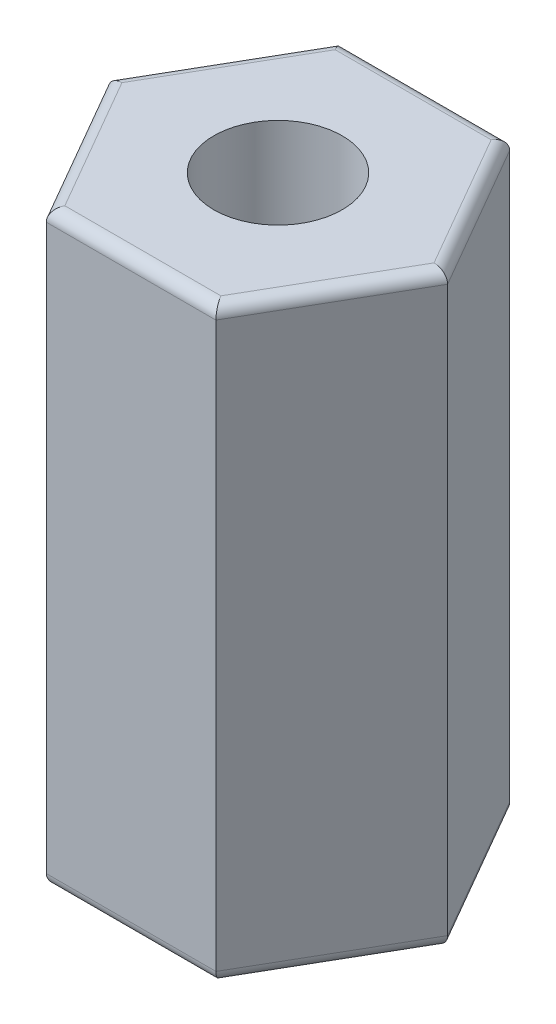
ISO-10303-21;
HEADER;
FILE_DESCRIPTION(('STEP AP214'),'2;1');
FILE_NAME('part.step','',(''),(''),'','','');
FILE_SCHEMA(('AUTOMOTIVE_DESIGN { 1 0 10303 214 1 1 1 1 }'));
ENDSEC;
DATA;
#1=APPLICATION_CONTEXT('core data for automotive mechanical design processes');
#2=APPLICATION_PROTOCOL_DEFINITION('international standard','automotive_design',2000,#1);
#3=PRODUCT_CONTEXT('',#1,'mechanical');
#4=PRODUCT('Part','Part','',(#3));
#5=PRODUCT_RELATED_PRODUCT_CATEGORY('part','',(#4));
#6=PRODUCT_DEFINITION_FORMATION('','',#4);
#7=PRODUCT_DEFINITION_CONTEXT('part definition',#1,'design');
#8=PRODUCT_DEFINITION('design','',#6,#7);
#9=PRODUCT_DEFINITION_SHAPE('','',#8);
#10=(LENGTH_UNIT() NAMED_UNIT(*) SI_UNIT(.MILLI.,.METRE.));
#11=(NAMED_UNIT(*) PLANE_ANGLE_UNIT() SI_UNIT($,.RADIAN.));
#12=(NAMED_UNIT(*) SI_UNIT($,.STERADIAN.) SOLID_ANGLE_UNIT());
#13=UNCERTAINTY_MEASURE_WITH_UNIT(LENGTH_MEASURE(1.E-05),#10,'distance_accuracy_value','');
#14=(GEOMETRIC_REPRESENTATION_CONTEXT(3) GLOBAL_UNCERTAINTY_ASSIGNED_CONTEXT((#13)) GLOBAL_UNIT_ASSIGNED_CONTEXT((#10,
#11,#12)) REPRESENTATION_CONTEXT('',''));
#15=CARTESIAN_POINT('',(0.,0.,0.));
#16=DIRECTION('',(0.,0.,1.));
#17=DIRECTION('',(1.,0.,0.));
#18=AXIS2_PLACEMENT_3D('',#15,#16,#17);
#19=CARTESIAN_POINT('',(1.44337567297406,10.,2.5));
#20=DIRECTION('',(-0.866025403784439,0.,-0.5));
#21=DIRECTION('',(-0.5,0.,0.866025403784439));
#22=AXIS2_PLACEMENT_3D('',#19,#20,#21);
#23=PLANE('',#22);
#24=DIRECTION('',(0.,-1.,0.));
#25=VECTOR('',#24,1.);
#26=CARTESIAN_POINT('',(2.88675134594813,10.,0.));
#27=LINE('',#26,#25);
#28=CARTESIAN_POINT('',(2.88675134594813,9.8,0.));
#29=VERTEX_POINT('',#28);
#30=CARTESIAN_POINT('',(2.88675134594813,0.200000000000001,0.));
#31=VERTEX_POINT('',#30);
#32=EDGE_CURVE('E149',#29,#31,#27,.T.);
#33=ORIENTED_EDGE('',*,*,#32,.F.);
#34=DIRECTION('',(0.5,0.,-0.866025403784439));
#35=VECTOR('',#34,1.);
#36=CARTESIAN_POINT('',(1.44337567297406,9.8,2.5));
#37=LINE('',#36,#35);
#38=CARTESIAN_POINT('',(1.44337567297406,9.8,2.5));
#39=VERTEX_POINT('',#38);
#40=EDGE_CURVE('E140',#29,#39,#37,.F.);
#41=ORIENTED_EDGE('',*,*,#40,.T.);
#42=DIRECTION('',(0.,-1.,0.));
#43=VECTOR('',#42,1.);
#44=CARTESIAN_POINT('',(1.44337567297406,10.,2.5));
#45=LINE('',#44,#43);
#46=CARTESIAN_POINT('',(1.44337567297406,0.200000000000001,2.5));
#47=VERTEX_POINT('',#46);
#48=EDGE_CURVE('E206',#39,#47,#45,.T.);
#49=ORIENTED_EDGE('',*,*,#48,.T.);
#50=DIRECTION('',(0.5,0.,-0.866025403784439));
#51=VECTOR('',#50,1.);
#52=CARTESIAN_POINT('',(1.44337567297406,0.200000000000001,2.5));
#53=LINE('',#52,#51);
#54=EDGE_CURVE('E181',#47,#31,#53,.T.);
#55=ORIENTED_EDGE('',*,*,#54,.T.);
#56=EDGE_LOOP('',(#33,#41,#49,#55));
#57=FACE_BOUND('',#56,.T.);
#58=ADVANCED_FACE('F33',(#57),#23,.F.);
#59=CARTESIAN_POINT('',(2.88675134594813,10.,0.));
#60=DIRECTION('',(-0.866025403784439,0.,0.5));
#61=DIRECTION('',(0.5,0.,0.866025403784439));
#62=AXIS2_PLACEMENT_3D('',#59,#60,#61);
#63=PLANE('',#62);
#64=DIRECTION('',(0.,-1.,0.));
#65=VECTOR('',#64,1.);
#66=CARTESIAN_POINT('',(1.44337567297406,10.,-2.5));
#67=LINE('',#66,#65);
#68=CARTESIAN_POINT('',(1.44337567297406,9.8,-2.5));
#69=VERTEX_POINT('',#68);
#70=CARTESIAN_POINT('',(1.44337567297406,0.200000000000001,-2.5));
#71=VERTEX_POINT('',#70);
#72=EDGE_CURVE('E152',#69,#71,#67,.T.);
#73=ORIENTED_EDGE('',*,*,#72,.F.);
#74=DIRECTION('',(-0.5,0.,-0.866025403784439));
#75=VECTOR('',#74,1.);
#76=CARTESIAN_POINT('',(2.88675134594813,9.8,0.));
#77=LINE('',#76,#75);
#78=EDGE_CURVE('E186',#69,#29,#77,.F.);
#79=ORIENTED_EDGE('',*,*,#78,.T.);
#80=ORIENTED_EDGE('',*,*,#32,.T.);
#81=DIRECTION('',(-0.5,0.,-0.866025403784439));
#82=VECTOR('',#81,1.);
#83=CARTESIAN_POINT('',(2.88675134594813,0.200000000000001,0.));
#84=LINE('',#83,#82);
#85=EDGE_CURVE('E184',#31,#71,#84,.T.);
#86=ORIENTED_EDGE('',*,*,#85,.T.);
#87=EDGE_LOOP('',(#73,#79,#80,#86));
#88=FACE_BOUND('',#87,.T.);
#89=ADVANCED_FACE('F267',(#88),#63,.F.);
#90=CARTESIAN_POINT('',(1.44337567297406,10.,-2.5));
#91=DIRECTION('',(0.,0.,1.));
#92=DIRECTION('',(1.,0.,0.));
#93=AXIS2_PLACEMENT_3D('',#90,#91,#92);
#94=PLANE('',#93);
#95=DIRECTION('',(0.,-1.,0.));
#96=VECTOR('',#95,1.);
#97=CARTESIAN_POINT('',(-1.44337567297406,10.,-2.5));
#98=LINE('',#97,#96);
#99=CARTESIAN_POINT('',(-1.44337567297406,9.8,-2.5));
#100=VERTEX_POINT('',#99);
#101=CARTESIAN_POINT('',(-1.44337567297406,0.200000000000001,-2.5));
#102=VERTEX_POINT('',#101);
#103=EDGE_CURVE('E258',#100,#102,#98,.T.);
#104=ORIENTED_EDGE('',*,*,#103,.F.);
#105=DIRECTION('',(-1.,0.,0.));
#106=VECTOR('',#105,1.);
#107=CARTESIAN_POINT('',(1.44337567297406,9.8,-2.5));
#108=LINE('',#107,#106);
#109=EDGE_CURVE('E165',#100,#69,#108,.F.);
#110=ORIENTED_EDGE('',*,*,#109,.T.);
#111=ORIENTED_EDGE('',*,*,#72,.T.);
#112=DIRECTION('',(-1.,0.,0.));
#113=VECTOR('',#112,1.);
#114=CARTESIAN_POINT('',(1.44337567297406,0.200000000000001,-2.5));
#115=LINE('',#114,#113);
#116=EDGE_CURVE('E163',#71,#102,#115,.T.);
#117=ORIENTED_EDGE('',*,*,#116,.T.);
#118=EDGE_LOOP('',(#104,#110,#111,#117));
#119=FACE_BOUND('',#118,.T.);
#120=ADVANCED_FACE('F264',(#119),#94,.F.);
#121=CARTESIAN_POINT('',(-1.44337567297406,10.,-2.5));
#122=DIRECTION('',(0.866025403784439,0.,0.5));
#123=DIRECTION('',(0.5,0.,-0.866025403784439));
#124=AXIS2_PLACEMENT_3D('',#121,#122,#123);
#125=PLANE('',#124);
#126=DIRECTION('',(0.,-1.,0.));
#127=VECTOR('',#126,1.);
#128=CARTESIAN_POINT('',(-2.88675134594813,10.,0.));
#129=LINE('',#128,#127);
#130=CARTESIAN_POINT('',(-2.88675134594813,9.8,0.));
#131=VERTEX_POINT('',#130);
#132=CARTESIAN_POINT('',(-2.88675134594813,0.200000000000001,0.));
#133=VERTEX_POINT('',#132);
#134=EDGE_CURVE('E251',#131,#133,#129,.T.);
#135=ORIENTED_EDGE('',*,*,#134,.F.);
#136=DIRECTION('',(-0.5,0.,0.866025403784439));
#137=VECTOR('',#136,1.);
#138=CARTESIAN_POINT('',(-1.44337567297406,9.8,-2.5));
#139=LINE('',#138,#137);
#140=EDGE_CURVE('E170',#131,#100,#139,.F.);
#141=ORIENTED_EDGE('',*,*,#140,.T.);
#142=ORIENTED_EDGE('',*,*,#103,.T.);
#143=DIRECTION('',(-0.5,0.,0.866025403784439));
#144=VECTOR('',#143,1.);
#145=CARTESIAN_POINT('',(-1.44337567297406,0.200000000000001,-2.5));
#146=LINE('',#145,#144);
#147=EDGE_CURVE('E168',#102,#133,#146,.T.);
#148=ORIENTED_EDGE('',*,*,#147,.T.);
#149=EDGE_LOOP('',(#135,#141,#142,#148));
#150=FACE_BOUND('',#149,.T.);
#151=ADVANCED_FACE('F274',(#150),#125,.F.);
#152=CARTESIAN_POINT('',(-2.88675134594813,10.,0.));
#153=DIRECTION('',(0.866025403784439,0.,-0.5));
#154=DIRECTION('',(-0.5,0.,-0.866025403784439));
#155=AXIS2_PLACEMENT_3D('',#152,#153,#154);
#156=PLANE('',#155);
#157=DIRECTION('',(0.,-1.,0.));
#158=VECTOR('',#157,1.);
#159=CARTESIAN_POINT('',(-1.44337567297406,10.,2.5));
#160=LINE('',#159,#158);
#161=CARTESIAN_POINT('',(-1.44337567297406,9.8,2.5));
#162=VERTEX_POINT('',#161);
#163=CARTESIAN_POINT('',(-1.44337567297406,0.200000000000001,2.5));
#164=VERTEX_POINT('',#163);
#165=EDGE_CURVE('E247',#162,#164,#160,.T.);
#166=ORIENTED_EDGE('',*,*,#165,.F.);
#167=DIRECTION('',(0.5,0.,0.866025403784439));
#168=VECTOR('',#167,1.);
#169=CARTESIAN_POINT('',(-2.88675134594813,9.8,0.));
#170=LINE('',#169,#168);
#171=EDGE_CURVE('E174',#162,#131,#170,.F.);
#172=ORIENTED_EDGE('',*,*,#171,.T.);
#173=ORIENTED_EDGE('',*,*,#134,.T.);
#174=DIRECTION('',(0.5,0.,0.866025403784439));
#175=VECTOR('',#174,1.);
#176=CARTESIAN_POINT('',(-2.88675134594813,0.200000000000001,0.));
#177=LINE('',#176,#175);
#178=EDGE_CURVE('E172',#133,#164,#177,.T.);
#179=ORIENTED_EDGE('',*,*,#178,.T.);
#180=EDGE_LOOP('',(#166,#172,#173,#179));
#181=FACE_BOUND('',#180,.T.);
#182=ADVANCED_FACE('F361',(#181),#156,.F.);
#183=CARTESIAN_POINT('',(-1.44337567297406,10.,2.5));
#184=DIRECTION('',(0.,0.,-1.));
#185=DIRECTION('',(-1.,0.,0.));
#186=AXIS2_PLACEMENT_3D('',#183,#184,#185);
#187=PLANE('',#186);
#188=ORIENTED_EDGE('',*,*,#48,.F.);
#189=DIRECTION('',(1.,0.,0.));
#190=VECTOR('',#189,1.);
#191=CARTESIAN_POINT('',(-1.44337567297406,9.8,2.5));
#192=LINE('',#191,#190);
#193=EDGE_CURVE('E179',#39,#162,#192,.F.);
#194=ORIENTED_EDGE('',*,*,#193,.T.);
#195=ORIENTED_EDGE('',*,*,#165,.T.);
#196=DIRECTION('',(1.,0.,0.));
#197=VECTOR('',#196,1.);
#198=CARTESIAN_POINT('',(-1.44337567297406,0.200000000000001,2.5));
#199=LINE('',#198,#197);
#200=EDGE_CURVE('E176',#164,#47,#199,.T.);
#201=ORIENTED_EDGE('',*,*,#200,.T.);
#202=EDGE_LOOP('',(#188,#194,#195,#201));
#203=FACE_BOUND('',#202,.T.);
#204=ADVANCED_FACE('F244',(#203),#187,.F.);
#205=CARTESIAN_POINT('',(2.88675134594813,10.,0.));
#206=DIRECTION('',(0.,1.,0.));
#207=DIRECTION('',(0.,0.,1.));
#208=AXIS2_PLACEMENT_3D('',#205,#206,#207);
#209=PLANE('',#208);
#210=CARTESIAN_POINT('',(0.,10.,0.));
#211=DIRECTION('',(0.,1.,0.));
#212=DIRECTION('',(0.,0.,1.));
#213=AXIS2_PLACEMENT_3D('',#210,#211,#212);
#214=CIRCLE('',#213,1.0922);
#215=CARTESIAN_POINT('',(0.,10.,1.0922));
#216=VERTEX_POINT('',#215);
#217=EDGE_CURVE('E209',#216,#216,#214,.T.);
#218=ORIENTED_EDGE('',*,*,#217,.F.);
#219=EDGE_LOOP('',(#218));
#220=FACE_BOUND('',#219,.T.);
#221=DIRECTION('',(-0.5,0.,-0.866025403784439));
#222=VECTOR('',#221,1.);
#223=CARTESIAN_POINT('',(1.27017059221718,10.,-2.4));
#224=LINE('',#223,#222);
#225=CARTESIAN_POINT('',(2.65581123827228,10.,0.));
#226=VERTEX_POINT('',#225);
#227=CARTESIAN_POINT('',(1.32790561913614,10.,-2.3));
#228=VERTEX_POINT('',#227);
#229=EDGE_CURVE('E128',#226,#228,#224,.T.);
#230=ORIENTED_EDGE('',*,*,#229,.T.);
#231=DIRECTION('',(-1.,0.,0.));
#232=VECTOR('',#231,1.);
#233=CARTESIAN_POINT('',(-1.44337567297406,10.,-2.3));
#234=LINE('',#233,#232);
#235=CARTESIAN_POINT('',(-1.32790561913614,10.,-2.3));
#236=VERTEX_POINT('',#235);
#237=EDGE_CURVE('E161',#228,#236,#234,.T.);
#238=ORIENTED_EDGE('',*,*,#237,.T.);
#239=DIRECTION('',(-0.5,0.,0.866025403784439));
#240=VECTOR('',#239,1.);
#241=CARTESIAN_POINT('',(-2.71354626519124,10.,0.100000000000001));
#242=LINE('',#241,#240);
#243=CARTESIAN_POINT('',(-2.65581123827228,10.,0.));
#244=VERTEX_POINT('',#243);
#245=EDGE_CURVE('E159',#236,#244,#242,.T.);
#246=ORIENTED_EDGE('',*,*,#245,.T.);
#247=DIRECTION('',(0.5,0.,0.866025403784439));
#248=VECTOR('',#247,1.);
#249=CARTESIAN_POINT('',(-1.27017059221718,10.,2.4));
#250=LINE('',#249,#248);
#251=CARTESIAN_POINT('',(-1.32790561913614,10.,2.3));
#252=VERTEX_POINT('',#251);
#253=EDGE_CURVE('E157',#244,#252,#250,.T.);
#254=ORIENTED_EDGE('',*,*,#253,.T.);
#255=DIRECTION('',(1.,0.,0.));
#256=VECTOR('',#255,1.);
#257=CARTESIAN_POINT('',(1.44337567297406,10.,2.3));
#258=LINE('',#257,#256);
#259=CARTESIAN_POINT('',(1.32790561913614,10.,2.3));
#260=VERTEX_POINT('',#259);
#261=EDGE_CURVE('E131',#252,#260,#258,.T.);
#262=ORIENTED_EDGE('',*,*,#261,.T.);
#263=DIRECTION('',(0.5,0.,-0.866025403784439));
#264=VECTOR('',#263,1.);
#265=CARTESIAN_POINT('',(2.71354626519124,10.,-0.100000000000001));
#266=LINE('',#265,#264);
#267=EDGE_CURVE('E123',#260,#226,#266,.T.);
#268=ORIENTED_EDGE('',*,*,#267,.T.);
#269=EDGE_LOOP('',(#230,#238,#246,#254,#262,#268));
#270=FACE_BOUND('',#269,.T.);
#271=ADVANCED_FACE('F125',(#220,#270),#209,.T.);
#272=CARTESIAN_POINT('',(2.88675134594813,0.,0.));
#273=DIRECTION('',(0.,1.,0.));
#274=DIRECTION('',(0.,0.,1.));
#275=AXIS2_PLACEMENT_3D('',#272,#273,#274);
#276=PLANE('',#275);
#277=CARTESIAN_POINT('',(0.,0.,0.));
#278=DIRECTION('',(0.,-1.,0.));
#279=DIRECTION('',(0.,0.,-1.));
#280=AXIS2_PLACEMENT_3D('',#277,#278,#279);
#281=CIRCLE('',#280,1.0922);
#282=CARTESIAN_POINT('',(0.,0.,-1.0922));
#283=VERTEX_POINT('',#282);
#284=EDGE_CURVE('E460',#283,#283,#281,.T.);
#285=ORIENTED_EDGE('',*,*,#284,.F.);
#286=EDGE_LOOP('',(#285));
#287=FACE_BOUND('',#286,.T.);
#288=DIRECTION('',(0.5,0.,-0.866025403784439));
#289=VECTOR('',#288,1.);
#290=CARTESIAN_POINT('',(2.71354626519124,0.,-0.100000000000001));
#291=LINE('',#290,#289);
#292=CARTESIAN_POINT('',(2.65581123827228,0.,0.));
#293=VERTEX_POINT('',#292);
#294=CARTESIAN_POINT('',(1.32790561913614,0.,2.3));
#295=VERTEX_POINT('',#294);
#296=EDGE_CURVE('E188',#293,#295,#291,.F.);
#297=ORIENTED_EDGE('',*,*,#296,.T.);
#298=DIRECTION('',(1.,0.,0.));
#299=VECTOR('',#298,1.);
#300=CARTESIAN_POINT('',(2.88675134594813,0.,2.3));
#301=LINE('',#300,#299);
#302=CARTESIAN_POINT('',(-1.32790561913614,0.,2.3));
#303=VERTEX_POINT('',#302);
#304=EDGE_CURVE('E11',#295,#303,#301,.F.);
#305=ORIENTED_EDGE('',*,*,#304,.T.);
#306=DIRECTION('',(0.5,0.,0.866025403784439));
#307=VECTOR('',#306,1.);
#308=CARTESIAN_POINT('',(-1.27017059221718,0.,2.4));
#309=LINE('',#308,#307);
#310=CARTESIAN_POINT('',(-2.65581123827228,0.,0.));
#311=VERTEX_POINT('',#310);
#312=EDGE_CURVE('E42',#303,#311,#309,.F.);
#313=ORIENTED_EDGE('',*,*,#312,.T.);
#314=DIRECTION('',(-0.5,0.,0.866025403784439));
#315=VECTOR('',#314,1.);
#316=CARTESIAN_POINT('',(-1.27017059221718,0.,-2.4));
#317=LINE('',#316,#315);
#318=CARTESIAN_POINT('',(-1.32790561913614,0.,-2.3));
#319=VERTEX_POINT('',#318);
#320=EDGE_CURVE('E194',#311,#319,#317,.F.);
#321=ORIENTED_EDGE('',*,*,#320,.T.);
#322=DIRECTION('',(-1.,0.,0.));
#323=VECTOR('',#322,1.);
#324=CARTESIAN_POINT('',(2.88675134594813,0.,-2.3));
#325=LINE('',#324,#323);
#326=CARTESIAN_POINT('',(1.32790561913614,0.,-2.3));
#327=VERTEX_POINT('',#326);
#328=EDGE_CURVE('E192',#319,#327,#325,.F.);
#329=ORIENTED_EDGE('',*,*,#328,.T.);
#330=DIRECTION('',(-0.5,0.,-0.866025403784439));
#331=VECTOR('',#330,1.);
#332=CARTESIAN_POINT('',(2.71354626519124,0.,0.0999999999999995));
#333=LINE('',#332,#331);
#334=EDGE_CURVE('E190',#327,#293,#333,.F.);
#335=ORIENTED_EDGE('',*,*,#334,.T.);
#336=EDGE_LOOP('',(#297,#305,#313,#321,#329,#335));
#337=FACE_BOUND('',#336,.T.);
#338=ADVANCED_FACE('F231',(#287,#337),#276,.F.);
#339=CARTESIAN_POINT('',(2.88675134594813,9.8,2.3));
#340=DIRECTION('',(-1.,0.,0.));
#341=DIRECTION('',(0.,0.,1.));
#342=AXIS2_PLACEMENT_3D('',#339,#340,#341);
#343=CYLINDRICAL_SURFACE('',#342,0.2);
#344=CARTESIAN_POINT('',(-1.32790561913614,9.8,2.3));
#345=DIRECTION('',(-0.866025403784439,0.,-0.5));
#346=DIRECTION('',(-0.5,0.,0.866025403784439));
#347=AXIS2_PLACEMENT_3D('',#344,#345,#346);
#348=ELLIPSE('',#347,0.23094010767585,0.2);
#349=EDGE_CURVE('E143',#162,#252,#348,.T.);
#350=ORIENTED_EDGE('',*,*,#349,.F.);
#351=ORIENTED_EDGE('',*,*,#193,.F.);
#352=CARTESIAN_POINT('',(1.32790561913614,9.8,2.3));
#353=DIRECTION('',(-0.866025403784438,0.,0.5));
#354=DIRECTION('',(0.5,0.,0.866025403784439));
#355=AXIS2_PLACEMENT_3D('',#352,#353,#354);
#356=ELLIPSE('',#355,0.23094010767585,0.2);
#357=EDGE_CURVE('E204',#260,#39,#356,.F.);
#358=ORIENTED_EDGE('',*,*,#357,.F.);
#359=ORIENTED_EDGE('',*,*,#261,.F.);
#360=EDGE_LOOP('',(#350,#351,#358,#359));
#361=FACE_BOUND('',#360,.T.);
#362=ADVANCED_FACE('F295',(#361),#343,.T.);
#363=CARTESIAN_POINT('',(2.71354626519124,9.8,-0.100000000000001));
#364=DIRECTION('',(-0.5,0.,0.866025403784439));
#365=DIRECTION('',(0.866025403784439,0.,0.5));
#366=AXIS2_PLACEMENT_3D('',#363,#364,#365);
#367=CYLINDRICAL_SURFACE('',#366,0.2);
#368=ORIENTED_EDGE('',*,*,#357,.T.);
#369=ORIENTED_EDGE('',*,*,#40,.F.);
#370=CARTESIAN_POINT('',(2.65581123827228,9.8,0.));
#371=DIRECTION('',(0.,0.,1.));
#372=DIRECTION('',(1.,0.,0.));
#373=AXIS2_PLACEMENT_3D('',#370,#371,#372);
#374=ELLIPSE('',#373,0.23094010767585,0.2);
#375=EDGE_CURVE('E138',#226,#29,#374,.F.);
#376=ORIENTED_EDGE('',*,*,#375,.F.);
#377=ORIENTED_EDGE('',*,*,#267,.F.);
#378=EDGE_LOOP('',(#368,#369,#376,#377));
#379=FACE_BOUND('',#378,.T.);
#380=ADVANCED_FACE('F139',(#379),#367,.T.);
#381=CARTESIAN_POINT('',(-1.27017059221718,9.8,2.4));
#382=DIRECTION('',(-0.5,0.,-0.866025403784439));
#383=DIRECTION('',(-0.866025403784439,0.,0.5));
#384=AXIS2_PLACEMENT_3D('',#381,#382,#383);
#385=CYLINDRICAL_SURFACE('',#384,0.2);
#386=ORIENTED_EDGE('',*,*,#349,.T.);
#387=ORIENTED_EDGE('',*,*,#253,.F.);
#388=CARTESIAN_POINT('',(-2.65581123827228,9.8,0.));
#389=DIRECTION('',(0.,0.,-1.));
#390=DIRECTION('',(-1.,0.,0.));
#391=AXIS2_PLACEMENT_3D('',#388,#389,#390);
#392=ELLIPSE('',#391,0.23094010767585,0.2);
#393=EDGE_CURVE('E144',#131,#244,#392,.T.);
#394=ORIENTED_EDGE('',*,*,#393,.F.);
#395=ORIENTED_EDGE('',*,*,#171,.F.);
#396=EDGE_LOOP('',(#386,#387,#394,#395));
#397=FACE_BOUND('',#396,.T.);
#398=ADVANCED_FACE('F289',(#397),#385,.T.);
#399=CARTESIAN_POINT('',(2.71354626519124,9.8,0.0999999999999994));
#400=DIRECTION('',(0.5,0.,0.866025403784439));
#401=DIRECTION('',(0.866025403784439,0.,-0.5));
#402=AXIS2_PLACEMENT_3D('',#399,#400,#401);
#403=CYLINDRICAL_SURFACE('',#402,0.2);
#404=ORIENTED_EDGE('',*,*,#375,.T.);
#405=ORIENTED_EDGE('',*,*,#78,.F.);
#406=CARTESIAN_POINT('',(1.32790561913614,9.8,-2.3));
#407=DIRECTION('',(0.866025403784439,0.,0.5));
#408=DIRECTION('',(-0.5,0.,0.866025403784439));
#409=AXIS2_PLACEMENT_3D('',#406,#407,#408);
#410=ELLIPSE('',#409,0.23094010767585,0.2);
#411=EDGE_CURVE('E147',#228,#69,#410,.F.);
#412=ORIENTED_EDGE('',*,*,#411,.F.);
#413=ORIENTED_EDGE('',*,*,#229,.F.);
#414=EDGE_LOOP('',(#404,#405,#412,#413));
#415=FACE_BOUND('',#414,.T.);
#416=ADVANCED_FACE('F146',(#415),#403,.T.);
#417=CARTESIAN_POINT('',(-1.27017059221718,9.8,-2.4));
#418=DIRECTION('',(0.5,0.,-0.866025403784439));
#419=DIRECTION('',(-0.866025403784439,0.,-0.5));
#420=AXIS2_PLACEMENT_3D('',#417,#418,#419);
#421=CYLINDRICAL_SURFACE('',#420,0.2);
#422=ORIENTED_EDGE('',*,*,#393,.T.);
#423=ORIENTED_EDGE('',*,*,#245,.F.);
#424=CARTESIAN_POINT('',(-1.32790561913614,9.8,-2.3));
#425=DIRECTION('',(0.866025403784439,0.,-0.5));
#426=DIRECTION('',(-0.5,0.,-0.866025403784439));
#427=AXIS2_PLACEMENT_3D('',#424,#425,#426);
#428=ELLIPSE('',#427,0.23094010767585,0.2);
#429=EDGE_CURVE('E197',#100,#236,#428,.T.);
#430=ORIENTED_EDGE('',*,*,#429,.F.);
#431=ORIENTED_EDGE('',*,*,#140,.F.);
#432=EDGE_LOOP('',(#422,#423,#430,#431));
#433=FACE_BOUND('',#432,.T.);
#434=ADVANCED_FACE('F282',(#433),#421,.T.);
#435=CARTESIAN_POINT('',(2.88675134594813,9.8,-2.3));
#436=DIRECTION('',(1.,0.,0.));
#437=DIRECTION('',(0.,0.,-1.));
#438=AXIS2_PLACEMENT_3D('',#435,#436,#437);
#439=CYLINDRICAL_SURFACE('',#438,0.2);
#440=ORIENTED_EDGE('',*,*,#411,.T.);
#441=ORIENTED_EDGE('',*,*,#109,.F.);
#442=ORIENTED_EDGE('',*,*,#429,.T.);
#443=ORIENTED_EDGE('',*,*,#237,.F.);
#444=EDGE_LOOP('',(#440,#441,#442,#443));
#445=FACE_BOUND('',#444,.T.);
#446=ADVANCED_FACE('F279',(#445),#439,.T.);
#447=CARTESIAN_POINT('',(1.44337567297406,0.200000000000001,-2.3));
#448=DIRECTION('',(-1.,0.,0.));
#449=DIRECTION('',(0.,0.,1.));
#450=AXIS2_PLACEMENT_3D('',#447,#448,#449);
#451=CYLINDRICAL_SURFACE('',#450,0.2);
#452=CARTESIAN_POINT('',(1.32790561913614,0.200000000000001,-2.3));
#453=DIRECTION('',(-0.866025403784439,0.,-0.5));
#454=DIRECTION('',(0.5,0.,-0.866025403784439));
#455=AXIS2_PLACEMENT_3D('',#452,#453,#454);
#456=ELLIPSE('',#455,0.23094010767585,0.2);
#457=EDGE_CURVE('E216',#327,#71,#456,.F.);
#458=ORIENTED_EDGE('',*,*,#457,.F.);
#459=ORIENTED_EDGE('',*,*,#328,.F.);
#460=CARTESIAN_POINT('',(-1.32790561913614,0.200000000000001,-2.3));
#461=DIRECTION('',(-0.866025403784439,0.,0.5));
#462=DIRECTION('',(-0.5,0.,-0.866025403784439));
#463=AXIS2_PLACEMENT_3D('',#460,#461,#462);
#464=ELLIPSE('',#463,0.23094010767585,0.2);
#465=EDGE_CURVE('E37',#102,#319,#464,.T.);
#466=ORIENTED_EDGE('',*,*,#465,.F.);
#467=ORIENTED_EDGE('',*,*,#116,.F.);
#468=EDGE_LOOP('',(#458,#459,#466,#467));
#469=FACE_BOUND('',#468,.T.);
#470=ADVANCED_FACE('F35',(#469),#451,.T.);
#471=CARTESIAN_POINT('',(-1.27017059221718,0.200000000000001,-2.4));
#472=DIRECTION('',(-0.5,0.,0.866025403784439));
#473=DIRECTION('',(0.866025403784439,0.,0.5));
#474=AXIS2_PLACEMENT_3D('',#471,#472,#473);
#475=CYLINDRICAL_SURFACE('',#474,0.2);
#476=ORIENTED_EDGE('',*,*,#465,.T.);
#477=ORIENTED_EDGE('',*,*,#320,.F.);
#478=CARTESIAN_POINT('',(-2.65581123827228,0.200000000000001,0.));
#479=DIRECTION('',(0.,0.,1.));
#480=DIRECTION('',(-1.,0.,0.));
#481=AXIS2_PLACEMENT_3D('',#478,#479,#480);
#482=ELLIPSE('',#481,0.23094010767585,0.2);
#483=EDGE_CURVE('E214',#133,#311,#482,.T.);
#484=ORIENTED_EDGE('',*,*,#483,.F.);
#485=ORIENTED_EDGE('',*,*,#147,.F.);
#486=EDGE_LOOP('',(#476,#477,#484,#485));
#487=FACE_BOUND('',#486,.T.);
#488=ADVANCED_FACE('F226',(#487),#475,.T.);
#489=CARTESIAN_POINT('',(2.71354626519124,0.200000000000001,0.0999999999999992));
#490=DIRECTION('',(-0.5,0.,-0.866025403784439));
#491=DIRECTION('',(-0.866025403784439,0.,0.5));
#492=AXIS2_PLACEMENT_3D('',#489,#490,#491);
#493=CYLINDRICAL_SURFACE('',#492,0.2);
#494=ORIENTED_EDGE('',*,*,#457,.T.);
#495=ORIENTED_EDGE('',*,*,#85,.F.);
#496=CARTESIAN_POINT('',(2.65581123827228,0.200000000000001,0.));
#497=DIRECTION('',(0.,0.,-1.));
#498=DIRECTION('',(1.,0.,0.));
#499=AXIS2_PLACEMENT_3D('',#496,#497,#498);
#500=ELLIPSE('',#499,0.23094010767585,0.2);
#501=EDGE_CURVE('E211',#293,#31,#500,.F.);
#502=ORIENTED_EDGE('',*,*,#501,.F.);
#503=ORIENTED_EDGE('',*,*,#334,.F.);
#504=EDGE_LOOP('',(#494,#495,#502,#503));
#505=FACE_BOUND('',#504,.T.);
#506=ADVANCED_FACE('F234',(#505),#493,.T.);
#507=CARTESIAN_POINT('',(-2.71354626519124,0.200000000000001,-0.0999999999999996));
#508=DIRECTION('',(0.5,0.,0.866025403784439));
#509=DIRECTION('',(0.866025403784439,0.,-0.5));
#510=AXIS2_PLACEMENT_3D('',#507,#508,#509);
#511=CYLINDRICAL_SURFACE('',#510,0.2);
#512=ORIENTED_EDGE('',*,*,#483,.T.);
#513=ORIENTED_EDGE('',*,*,#312,.F.);
#514=CARTESIAN_POINT('',(-1.32790561913614,0.200000000000001,2.3));
#515=DIRECTION('',(0.866025403784439,0.,0.5));
#516=DIRECTION('',(-0.5,0.,0.866025403784439));
#517=AXIS2_PLACEMENT_3D('',#514,#515,#516);
#518=ELLIPSE('',#517,0.23094010767585,0.2);
#519=EDGE_CURVE('E50',#164,#303,#518,.T.);
#520=ORIENTED_EDGE('',*,*,#519,.F.);
#521=ORIENTED_EDGE('',*,*,#178,.F.);
#522=EDGE_LOOP('',(#512,#513,#520,#521));
#523=FACE_BOUND('',#522,.T.);
#524=ADVANCED_FACE('F304',(#523),#511,.T.);
#525=CARTESIAN_POINT('',(1.27017059221718,0.200000000000001,2.4));
#526=DIRECTION('',(0.5,0.,-0.866025403784439));
#527=DIRECTION('',(-0.866025403784439,0.,-0.5));
#528=AXIS2_PLACEMENT_3D('',#525,#526,#527);
#529=CYLINDRICAL_SURFACE('',#528,0.2);
#530=ORIENTED_EDGE('',*,*,#501,.T.);
#531=ORIENTED_EDGE('',*,*,#54,.F.);
#532=CARTESIAN_POINT('',(1.32790561913614,0.200000000000001,2.3));
#533=DIRECTION('',(0.866025403784438,0.,-0.5));
#534=DIRECTION('',(-0.5,0.,-0.866025403784439));
#535=AXIS2_PLACEMENT_3D('',#532,#533,#534);
#536=ELLIPSE('',#535,0.23094010767585,0.2);
#537=EDGE_CURVE('E207',#295,#47,#536,.F.);
#538=ORIENTED_EDGE('',*,*,#537,.F.);
#539=ORIENTED_EDGE('',*,*,#296,.F.);
#540=EDGE_LOOP('',(#530,#531,#538,#539));
#541=FACE_BOUND('',#540,.T.);
#542=ADVANCED_FACE('F238',(#541),#529,.T.);
#543=CARTESIAN_POINT('',(-1.44337567297406,0.200000000000001,2.3));
#544=DIRECTION('',(1.,0.,0.));
#545=DIRECTION('',(0.,0.,-1.));
#546=AXIS2_PLACEMENT_3D('',#543,#544,#545);
#547=CYLINDRICAL_SURFACE('',#546,0.2);
#548=ORIENTED_EDGE('',*,*,#519,.T.);
#549=ORIENTED_EDGE('',*,*,#304,.F.);
#550=ORIENTED_EDGE('',*,*,#537,.T.);
#551=ORIENTED_EDGE('',*,*,#200,.F.);
#552=EDGE_LOOP('',(#548,#549,#550,#551));
#553=FACE_BOUND('',#552,.T.);
#554=ADVANCED_FACE('F239',(#553),#547,.T.);
#555=CARTESIAN_POINT('',(0.,5.,0.));
#556=DIRECTION('',(0.,1.,0.));
#557=DIRECTION('',(0.,0.,1.));
#558=AXIS2_PLACEMENT_3D('',#555,#556,#557);
#559=CYLINDRICAL_SURFACE('',#558,1.0922);
#560=ORIENTED_EDGE('',*,*,#217,.T.);
#561=EDGE_LOOP('',(#560));
#562=FACE_BOUND('',#561,.T.);
#563=ORIENTED_EDGE('',*,*,#284,.T.);
#564=EDGE_LOOP('',(#563));
#565=FACE_BOUND('',#564,.T.);
#566=ADVANCED_FACE('F301',(#562,#565),#559,.F.);
#567=CLOSED_SHELL('',(#58,#89,#120,#151,#182,#204,#271,#338,#362,#380,#398,#416,#434,#446,#470,
#488,#506,#524,#542,#554,#566));
#568=MANIFOLD_SOLID_BREP('B2',#567);
#569=ADVANCED_BREP_SHAPE_REPRESENTATION('',(#18,#568),#14);
#570=SHAPE_DEFINITION_REPRESENTATION(#9,#569);
ENDSEC;
END-ISO-10303-21;
